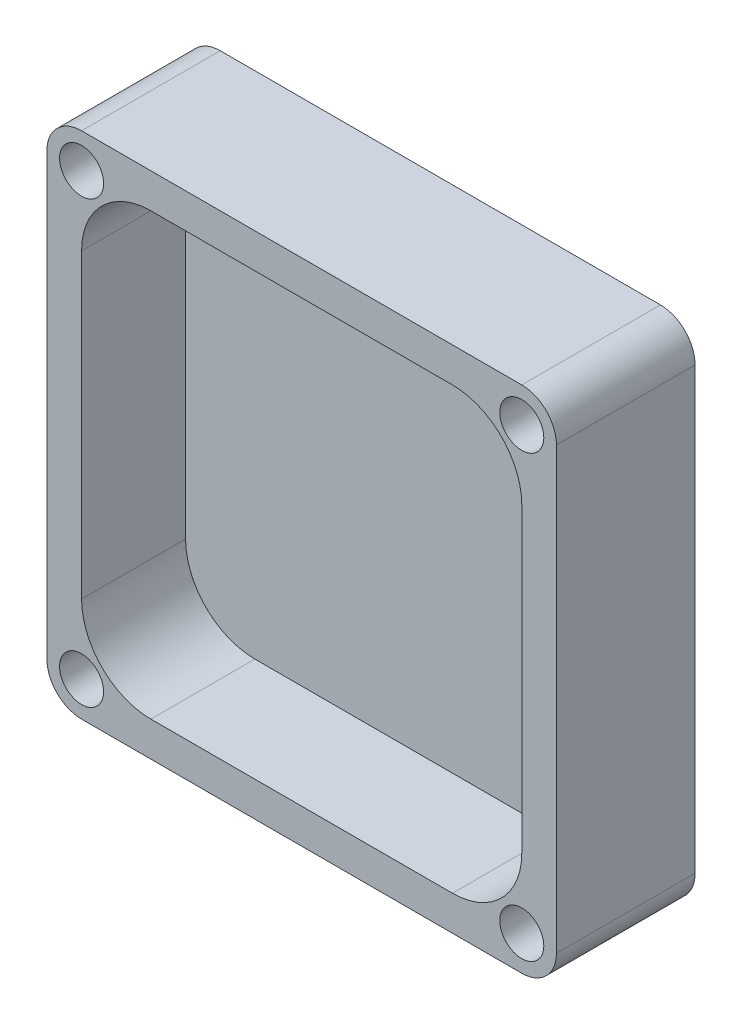
ISO-10303-21;
HEADER;
FILE_DESCRIPTION(('STEP AP214'),'2;1');
FILE_NAME('part.step','',(''),(''),'','','');
FILE_SCHEMA(('AUTOMOTIVE_DESIGN { 1 0 10303 214 1 1 1 1 }'));
ENDSEC;
DATA;
#1=APPLICATION_CONTEXT('core data for automotive mechanical design processes');
#2=APPLICATION_PROTOCOL_DEFINITION('international standard','automotive_design',2000,#1);
#3=PRODUCT_CONTEXT('',#1,'mechanical');
#4=PRODUCT('Part','Part','',(#3));
#5=PRODUCT_RELATED_PRODUCT_CATEGORY('part','',(#4));
#6=PRODUCT_DEFINITION_FORMATION('','',#4);
#7=PRODUCT_DEFINITION_CONTEXT('part definition',#1,'design');
#8=PRODUCT_DEFINITION('design','',#6,#7);
#9=PRODUCT_DEFINITION_SHAPE('','',#8);
#10=(LENGTH_UNIT() NAMED_UNIT(*) SI_UNIT(.MILLI.,.METRE.));
#11=(NAMED_UNIT(*) PLANE_ANGLE_UNIT() SI_UNIT($,.RADIAN.));
#12=(NAMED_UNIT(*) SI_UNIT($,.STERADIAN.) SOLID_ANGLE_UNIT());
#13=UNCERTAINTY_MEASURE_WITH_UNIT(LENGTH_MEASURE(1.E-05),#10,'distance_accuracy_value','');
#14=(GEOMETRIC_REPRESENTATION_CONTEXT(3) GLOBAL_UNCERTAINTY_ASSIGNED_CONTEXT((#13)) GLOBAL_UNIT_ASSIGNED_CONTEXT((#10,
#11,#12)) REPRESENTATION_CONTEXT('',''));
#15=CARTESIAN_POINT('',(0.,0.,0.));
#16=DIRECTION('',(0.,0.,1.));
#17=DIRECTION('',(1.,0.,0.));
#18=AXIS2_PLACEMENT_3D('',#15,#16,#17);
#19=CARTESIAN_POINT('',(0.,0.,0.));
#20=DIRECTION('',(0.,0.,-1.));
#21=DIRECTION('',(-1.,0.,0.));
#22=AXIS2_PLACEMENT_3D('',#19,#20,#21);
#23=PLANE('',#22);
#24=CARTESIAN_POINT('',(63.5,-63.5,0.));
#25=DIRECTION('',(0.,0.,1.));
#26=DIRECTION('',(1.,0.,0.));
#27=AXIS2_PLACEMENT_3D('',#24,#25,#26);
#28=CIRCLE('',#27,6.35);
#29=CARTESIAN_POINT('',(69.85,-63.5,0.));
#30=VERTEX_POINT('',#29);
#31=EDGE_CURVE('E249',#30,#30,#28,.T.);
#32=ORIENTED_EDGE('',*,*,#31,.T.);
#33=EDGE_LOOP('',(#32));
#34=FACE_BOUND('',#33,.T.);
#35=CARTESIAN_POINT('',(-63.5,63.5,0.));
#36=DIRECTION('',(0.,0.,1.));
#37=DIRECTION('',(1.,0.,0.));
#38=AXIS2_PLACEMENT_3D('',#35,#36,#37);
#39=CIRCLE('',#38,6.35000000000002);
#40=CARTESIAN_POINT('',(-57.15,63.5,0.));
#41=VERTEX_POINT('',#40);
#42=EDGE_CURVE('E255',#41,#41,#39,.T.);
#43=ORIENTED_EDGE('',*,*,#42,.T.);
#44=EDGE_LOOP('',(#43));
#45=FACE_BOUND('',#44,.T.);
#46=DIRECTION('',(-1.,0.,0.));
#47=VECTOR('',#46,1.);
#48=CARTESIAN_POINT('',(73.5,73.5,0.));
#49=LINE('',#48,#47);
#50=CARTESIAN_POINT('',(63.5,73.5,0.));
#51=VERTEX_POINT('',#50);
#52=CARTESIAN_POINT('',(-63.5,73.5,0.));
#53=VERTEX_POINT('',#52);
#54=EDGE_CURVE('E263',#51,#53,#49,.T.);
#55=ORIENTED_EDGE('',*,*,#54,.F.);
#56=CARTESIAN_POINT('',(63.5,63.5,0.));
#57=DIRECTION('',(0.,0.,-1.));
#58=DIRECTION('',(-1.,0.,0.));
#59=AXIS2_PLACEMENT_3D('',#56,#57,#58);
#60=CIRCLE('',#59,10.);
#61=CARTESIAN_POINT('',(73.5,63.4999999999999,0.));
#62=VERTEX_POINT('',#61);
#63=EDGE_CURVE('E280',#51,#62,#60,.T.);
#64=ORIENTED_EDGE('',*,*,#63,.T.);
#65=DIRECTION('',(0.,1.,0.));
#66=VECTOR('',#65,1.);
#67=CARTESIAN_POINT('',(73.5,-73.5,0.));
#68=LINE('',#67,#66);
#69=CARTESIAN_POINT('',(73.5,-63.5,0.));
#70=VERTEX_POINT('',#69);
#71=EDGE_CURVE('E260',#70,#62,#68,.T.);
#72=ORIENTED_EDGE('',*,*,#71,.F.);
#73=CARTESIAN_POINT('',(63.5,-63.5,0.));
#74=DIRECTION('',(0.,0.,-1.));
#75=DIRECTION('',(-1.,0.,0.));
#76=AXIS2_PLACEMENT_3D('',#73,#74,#75);
#77=CIRCLE('',#76,10.);
#78=CARTESIAN_POINT('',(63.5,-73.5,0.));
#79=VERTEX_POINT('',#78);
#80=EDGE_CURVE('E278',#70,#79,#77,.T.);
#81=ORIENTED_EDGE('',*,*,#80,.T.);
#82=DIRECTION('',(1.,0.,0.));
#83=VECTOR('',#82,1.);
#84=CARTESIAN_POINT('',(73.5,-73.5,0.));
#85=LINE('',#84,#83);
#86=CARTESIAN_POINT('',(-63.5,-73.5,0.));
#87=VERTEX_POINT('',#86);
#88=EDGE_CURVE('E258',#87,#79,#85,.T.);
#89=ORIENTED_EDGE('',*,*,#88,.F.);
#90=CARTESIAN_POINT('',(-63.5,-63.5,0.));
#91=DIRECTION('',(0.,0.,-1.));
#92=DIRECTION('',(-1.,0.,0.));
#93=AXIS2_PLACEMENT_3D('',#90,#91,#92);
#94=CIRCLE('',#93,10.);
#95=CARTESIAN_POINT('',(-73.5,-63.5,0.));
#96=VERTEX_POINT('',#95);
#97=EDGE_CURVE('E276',#87,#96,#94,.T.);
#98=ORIENTED_EDGE('',*,*,#97,.T.);
#99=DIRECTION('',(0.,-1.,0.));
#100=VECTOR('',#99,1.);
#101=CARTESIAN_POINT('',(-73.5,-73.5,0.));
#102=LINE('',#101,#100);
#103=CARTESIAN_POINT('',(-73.5,63.5,0.));
#104=VERTEX_POINT('',#103);
#105=EDGE_CURVE('E266',#104,#96,#102,.T.);
#106=ORIENTED_EDGE('',*,*,#105,.F.);
#107=CARTESIAN_POINT('',(-63.5,63.5,0.));
#108=DIRECTION('',(0.,0.,-1.));
#109=DIRECTION('',(-1.,0.,0.));
#110=AXIS2_PLACEMENT_3D('',#107,#108,#109);
#111=CIRCLE('',#110,10.);
#112=EDGE_CURVE('E274',#104,#53,#111,.T.);
#113=ORIENTED_EDGE('',*,*,#112,.T.);
#114=EDGE_LOOP('',(#55,#64,#72,#81,#89,#98,#106,#113));
#115=FACE_BOUND('',#114,.T.);
#116=CARTESIAN_POINT('',(63.5,63.5,0.));
#117=DIRECTION('',(0.,0.,1.));
#118=DIRECTION('',(1.,0.,0.));
#119=AXIS2_PLACEMENT_3D('',#116,#117,#118);
#120=CIRCLE('',#119,6.34999999999999);
#121=CARTESIAN_POINT('',(69.85,63.5,0.));
#122=VERTEX_POINT('',#121);
#123=EDGE_CURVE('E252',#122,#122,#120,.T.);
#124=ORIENTED_EDGE('',*,*,#123,.T.);
#125=EDGE_LOOP('',(#124));
#126=FACE_BOUND('',#125,.T.);
#127=CARTESIAN_POINT('',(-63.5,-63.5,0.));
#128=DIRECTION('',(0.,0.,1.));
#129=DIRECTION('',(1.,0.,0.));
#130=AXIS2_PLACEMENT_3D('',#127,#128,#129);
#131=CIRCLE('',#130,6.35);
#132=CARTESIAN_POINT('',(-57.15,-63.5,0.));
#133=VERTEX_POINT('',#132);
#134=EDGE_CURVE('E246',#133,#133,#131,.T.);
#135=ORIENTED_EDGE('',*,*,#134,.T.);
#136=EDGE_LOOP('',(#135));
#137=FACE_BOUND('',#136,.T.);
#138=ADVANCED_FACE('F39',(#34,#45,#115,#126,#137),#23,.T.);
#139=CARTESIAN_POINT('',(73.5,-73.5,10.));
#140=DIRECTION('',(0.,1.,0.));
#141=DIRECTION('',(0.,0.,1.));
#142=AXIS2_PLACEMENT_3D('',#139,#140,#141);
#143=PLANE('',#142);
#144=ORIENTED_EDGE('',*,*,#88,.T.);
#145=DIRECTION('',(0.,0.,-1.));
#146=VECTOR('',#145,1.);
#147=CARTESIAN_POINT('',(63.5,-73.5,10.));
#148=LINE('',#147,#146);
#149=CARTESIAN_POINT('',(63.5,-73.5,40.));
#150=VERTEX_POINT('',#149);
#151=EDGE_CURVE('E54',#79,#150,#148,.F.);
#152=ORIENTED_EDGE('',*,*,#151,.T.);
#153=DIRECTION('',(1.,0.,0.));
#154=VECTOR('',#153,1.);
#155=CARTESIAN_POINT('',(-73.5,-73.5,40.));
#156=LINE('',#155,#154);
#157=CARTESIAN_POINT('',(-63.5,-73.5,40.));
#158=VERTEX_POINT('',#157);
#159=EDGE_CURVE('E238',#158,#150,#156,.T.);
#160=ORIENTED_EDGE('',*,*,#159,.F.);
#161=DIRECTION('',(0.,0.,-1.));
#162=VECTOR('',#161,1.);
#163=CARTESIAN_POINT('',(-63.5,-73.5,10.));
#164=LINE('',#163,#162);
#165=EDGE_CURVE('E294',#158,#87,#164,.T.);
#166=ORIENTED_EDGE('',*,*,#165,.T.);
#167=EDGE_LOOP('',(#144,#152,#160,#166));
#168=FACE_BOUND('',#167,.T.);
#169=ADVANCED_FACE('F313',(#168),#143,.F.);
#170=CARTESIAN_POINT('',(73.5,-73.5,10.));
#171=DIRECTION('',(-1.,0.,0.));
#172=DIRECTION('',(0.,0.,1.));
#173=AXIS2_PLACEMENT_3D('',#170,#171,#172);
#174=PLANE('',#173);
#175=ORIENTED_EDGE('',*,*,#71,.T.);
#176=DIRECTION('',(0.,0.,-1.));
#177=VECTOR('',#176,1.);
#178=CARTESIAN_POINT('',(73.5,63.5,10.));
#179=LINE('',#178,#177);
#180=CARTESIAN_POINT('',(73.5,63.4999999999999,40.));
#181=VERTEX_POINT('',#180);
#182=EDGE_CURVE('E285',#62,#181,#179,.F.);
#183=ORIENTED_EDGE('',*,*,#182,.T.);
#184=DIRECTION('',(0.,1.,0.));
#185=VECTOR('',#184,1.);
#186=CARTESIAN_POINT('',(73.5,-73.5,40.));
#187=LINE('',#186,#185);
#188=CARTESIAN_POINT('',(73.5,-63.5,40.));
#189=VERTEX_POINT('',#188);
#190=EDGE_CURVE('E240',#189,#181,#187,.T.);
#191=ORIENTED_EDGE('',*,*,#190,.F.);
#192=DIRECTION('',(0.,0.,-1.));
#193=VECTOR('',#192,1.);
#194=CARTESIAN_POINT('',(73.5,-63.5,10.));
#195=LINE('',#194,#193);
#196=EDGE_CURVE('E282',#189,#70,#195,.T.);
#197=ORIENTED_EDGE('',*,*,#196,.T.);
#198=EDGE_LOOP('',(#175,#183,#191,#197));
#199=FACE_BOUND('',#198,.T.);
#200=ADVANCED_FACE('F322',(#199),#174,.F.);
#201=CARTESIAN_POINT('',(73.5,73.5,10.));
#202=DIRECTION('',(0.,-1.,0.));
#203=DIRECTION('',(1.,0.,0.));
#204=AXIS2_PLACEMENT_3D('',#201,#202,#203);
#205=PLANE('',#204);
#206=DIRECTION('',(-1.,0.,0.));
#207=VECTOR('',#206,1.);
#208=CARTESIAN_POINT('',(73.5,73.5,40.));
#209=LINE('',#208,#207);
#210=CARTESIAN_POINT('',(63.5,73.5,40.));
#211=VERTEX_POINT('',#210);
#212=CARTESIAN_POINT('',(-63.5,73.5,40.));
#213=VERTEX_POINT('',#212);
#214=EDGE_CURVE('E243',#211,#213,#209,.T.);
#215=ORIENTED_EDGE('',*,*,#214,.F.);
#216=DIRECTION('',(0.,0.,-1.));
#217=VECTOR('',#216,1.);
#218=CARTESIAN_POINT('',(63.5,73.5,10.));
#219=LINE('',#218,#217);
#220=EDGE_CURVE('E271',#211,#51,#219,.T.);
#221=ORIENTED_EDGE('',*,*,#220,.T.);
#222=ORIENTED_EDGE('',*,*,#54,.T.);
#223=DIRECTION('',(0.,0.,-1.));
#224=VECTOR('',#223,1.);
#225=CARTESIAN_POINT('',(-63.5,73.5,10.));
#226=LINE('',#225,#224);
#227=EDGE_CURVE('E269',#53,#213,#226,.F.);
#228=ORIENTED_EDGE('',*,*,#227,.T.);
#229=EDGE_LOOP('',(#215,#221,#222,#228));
#230=FACE_BOUND('',#229,.T.);
#231=ADVANCED_FACE('F330',(#230),#205,.F.);
#232=CARTESIAN_POINT('',(-73.5,-73.5,10.));
#233=DIRECTION('',(1.,0.,0.));
#234=DIRECTION('',(0.,1.,0.));
#235=AXIS2_PLACEMENT_3D('',#232,#233,#234);
#236=PLANE('',#235);
#237=ORIENTED_EDGE('',*,*,#105,.T.);
#238=DIRECTION('',(0.,0.,-1.));
#239=VECTOR('',#238,1.);
#240=CARTESIAN_POINT('',(-73.5,-63.5,10.));
#241=LINE('',#240,#239);
#242=CARTESIAN_POINT('',(-73.5,-63.5,40.));
#243=VERTEX_POINT('',#242);
#244=EDGE_CURVE('E11',#96,#243,#241,.F.);
#245=ORIENTED_EDGE('',*,*,#244,.T.);
#246=DIRECTION('',(0.,-1.,0.));
#247=VECTOR('',#246,1.);
#248=CARTESIAN_POINT('',(-73.5,73.5,40.));
#249=LINE('',#248,#247);
#250=CARTESIAN_POINT('',(-73.5,63.5,40.));
#251=VERTEX_POINT('',#250);
#252=EDGE_CURVE('E236',#251,#243,#249,.T.);
#253=ORIENTED_EDGE('',*,*,#252,.F.);
#254=DIRECTION('',(0.,0.,-1.));
#255=VECTOR('',#254,1.);
#256=CARTESIAN_POINT('',(-73.5,63.5,10.));
#257=LINE('',#256,#255);
#258=EDGE_CURVE('E47',#251,#104,#257,.T.);
#259=ORIENTED_EDGE('',*,*,#258,.T.);
#260=EDGE_LOOP('',(#237,#245,#253,#259));
#261=FACE_BOUND('',#260,.T.);
#262=ADVANCED_FACE('F302',(#261),#236,.F.);
#263=CARTESIAN_POINT('',(-63.5,63.5,10.));
#264=DIRECTION('',(0.,0.,-1.));
#265=DIRECTION('',(-1.,0.,0.));
#266=AXIS2_PLACEMENT_3D('',#263,#264,#265);
#267=CYLINDRICAL_SURFACE('',#266,6.35000000000002);
#268=ORIENTED_EDGE('',*,*,#42,.F.);
#269=EDGE_LOOP('',(#268));
#270=FACE_BOUND('',#269,.T.);
#271=CARTESIAN_POINT('',(-63.5,63.5,40.));
#272=DIRECTION('',(0.,0.,1.));
#273=DIRECTION('',(1.,0.,0.));
#274=AXIS2_PLACEMENT_3D('',#271,#272,#273);
#275=CIRCLE('',#274,6.35000000000002);
#276=CARTESIAN_POINT('',(-57.15,63.5,40.));
#277=VERTEX_POINT('',#276);
#278=EDGE_CURVE('E172',#277,#277,#275,.T.);
#279=ORIENTED_EDGE('',*,*,#278,.T.);
#280=EDGE_LOOP('',(#279));
#281=FACE_BOUND('',#280,.T.);
#282=ADVANCED_FACE('F350',(#270,#281),#267,.F.);
#283=CARTESIAN_POINT('',(63.5,63.5,10.));
#284=DIRECTION('',(0.,0.,-1.));
#285=DIRECTION('',(-1.,0.,0.));
#286=AXIS2_PLACEMENT_3D('',#283,#284,#285);
#287=CYLINDRICAL_SURFACE('',#286,6.34999999999999);
#288=ORIENTED_EDGE('',*,*,#123,.F.);
#289=EDGE_LOOP('',(#288));
#290=FACE_BOUND('',#289,.T.);
#291=CARTESIAN_POINT('',(63.5,63.5,40.));
#292=DIRECTION('',(0.,0.,1.));
#293=DIRECTION('',(1.,0.,0.));
#294=AXIS2_PLACEMENT_3D('',#291,#292,#293);
#295=CIRCLE('',#294,6.34999999999999);
#296=CARTESIAN_POINT('',(69.85,63.5,40.));
#297=VERTEX_POINT('',#296);
#298=EDGE_CURVE('E227',#297,#297,#295,.T.);
#299=ORIENTED_EDGE('',*,*,#298,.T.);
#300=EDGE_LOOP('',(#299));
#301=FACE_BOUND('',#300,.T.);
#302=ADVANCED_FACE('F490',(#290,#301),#287,.F.);
#303=CARTESIAN_POINT('',(63.5,-63.5,10.));
#304=DIRECTION('',(0.,0.,-1.));
#305=DIRECTION('',(-1.,0.,0.));
#306=AXIS2_PLACEMENT_3D('',#303,#304,#305);
#307=CYLINDRICAL_SURFACE('',#306,6.35);
#308=ORIENTED_EDGE('',*,*,#31,.F.);
#309=EDGE_LOOP('',(#308));
#310=FACE_BOUND('',#309,.T.);
#311=CARTESIAN_POINT('',(63.5,-63.5,40.));
#312=DIRECTION('',(0.,0.,1.));
#313=DIRECTION('',(1.,0.,0.));
#314=AXIS2_PLACEMENT_3D('',#311,#312,#313);
#315=CIRCLE('',#314,6.35);
#316=CARTESIAN_POINT('',(69.85,-63.5,40.));
#317=VERTEX_POINT('',#316);
#318=EDGE_CURVE('E230',#317,#317,#315,.T.);
#319=ORIENTED_EDGE('',*,*,#318,.T.);
#320=EDGE_LOOP('',(#319));
#321=FACE_BOUND('',#320,.T.);
#322=ADVANCED_FACE('F480',(#310,#321),#307,.F.);
#323=CARTESIAN_POINT('',(-63.5,-63.5,10.));
#324=DIRECTION('',(0.,0.,-1.));
#325=DIRECTION('',(-1.,0.,0.));
#326=AXIS2_PLACEMENT_3D('',#323,#324,#325);
#327=CYLINDRICAL_SURFACE('',#326,6.35);
#328=ORIENTED_EDGE('',*,*,#134,.F.);
#329=EDGE_LOOP('',(#328));
#330=FACE_BOUND('',#329,.T.);
#331=CARTESIAN_POINT('',(-63.5,-63.5,40.));
#332=DIRECTION('',(0.,0.,1.));
#333=DIRECTION('',(1.,0.,0.));
#334=AXIS2_PLACEMENT_3D('',#331,#332,#333);
#335=CIRCLE('',#334,6.35);
#336=CARTESIAN_POINT('',(-57.15,-63.5,40.));
#337=VERTEX_POINT('',#336);
#338=EDGE_CURVE('E233',#337,#337,#335,.T.);
#339=ORIENTED_EDGE('',*,*,#338,.T.);
#340=EDGE_LOOP('',(#339));
#341=FACE_BOUND('',#340,.T.);
#342=ADVANCED_FACE('F469',(#330,#341),#327,.F.);
#343=CARTESIAN_POINT('',(0.,0.,40.));
#344=DIRECTION('',(0.,0.,1.));
#345=DIRECTION('',(1.,0.,0.));
#346=AXIS2_PLACEMENT_3D('',#343,#344,#345);
#347=PLANE('',#346);
#348=ORIENTED_EDGE('',*,*,#298,.F.);
#349=EDGE_LOOP('',(#348));
#350=FACE_BOUND('',#349,.T.);
#351=ORIENTED_EDGE('',*,*,#338,.F.);
#352=EDGE_LOOP('',(#351));
#353=FACE_BOUND('',#352,.T.);
#354=ORIENTED_EDGE('',*,*,#190,.T.);
#355=CARTESIAN_POINT('',(63.5,63.5,40.));
#356=DIRECTION('',(0.,0.,1.));
#357=DIRECTION('',(1.,0.,0.));
#358=AXIS2_PLACEMENT_3D('',#355,#356,#357);
#359=CIRCLE('',#358,10.);
#360=EDGE_CURVE('E292',#181,#211,#359,.T.);
#361=ORIENTED_EDGE('',*,*,#360,.T.);
#362=ORIENTED_EDGE('',*,*,#214,.T.);
#363=CARTESIAN_POINT('',(-63.5,63.5,40.));
#364=DIRECTION('',(0.,0.,1.));
#365=DIRECTION('',(1.,0.,0.));
#366=AXIS2_PLACEMENT_3D('',#363,#364,#365);
#367=CIRCLE('',#366,10.);
#368=EDGE_CURVE('E287',#213,#251,#367,.T.);
#369=ORIENTED_EDGE('',*,*,#368,.T.);
#370=ORIENTED_EDGE('',*,*,#252,.T.);
#371=CARTESIAN_POINT('',(-63.5,-63.5,40.));
#372=DIRECTION('',(0.,0.,1.));
#373=DIRECTION('',(1.,0.,0.));
#374=AXIS2_PLACEMENT_3D('',#371,#372,#373);
#375=CIRCLE('',#374,10.);
#376=EDGE_CURVE('E61',#243,#158,#375,.T.);
#377=ORIENTED_EDGE('',*,*,#376,.T.);
#378=ORIENTED_EDGE('',*,*,#159,.T.);
#379=CARTESIAN_POINT('',(63.5,-63.5,40.));
#380=DIRECTION('',(0.,0.,1.));
#381=DIRECTION('',(1.,0.,0.));
#382=AXIS2_PLACEMENT_3D('',#379,#380,#381);
#383=CIRCLE('',#382,10.);
#384=EDGE_CURVE('E290',#150,#189,#383,.T.);
#385=ORIENTED_EDGE('',*,*,#384,.T.);
#386=EDGE_LOOP('',(#354,#361,#362,#369,#370,#377,#378,#385));
#387=FACE_BOUND('',#386,.T.);
#388=ORIENTED_EDGE('',*,*,#318,.F.);
#389=EDGE_LOOP('',(#388));
#390=FACE_BOUND('',#389,.T.);
#391=ORIENTED_EDGE('',*,*,#278,.F.);
#392=EDGE_LOOP('',(#391));
#393=FACE_BOUND('',#392,.T.);
#394=DIRECTION('',(1.,0.,0.));
#395=VECTOR('',#394,1.);
#396=CARTESIAN_POINT('',(-43.4999999999999,-63.5,40.));
#397=LINE('',#396,#395);
#398=CARTESIAN_POINT('',(-43.4999999999999,-63.5,40.));
#399=VERTEX_POINT('',#398);
#400=CARTESIAN_POINT('',(43.4999999999999,-63.5,40.));
#401=VERTEX_POINT('',#400);
#402=EDGE_CURVE('E164',#399,#401,#397,.T.);
#403=ORIENTED_EDGE('',*,*,#402,.F.);
#404=CARTESIAN_POINT('',(-43.5,-43.5,40.));
#405=DIRECTION('',(0.,0.,1.));
#406=DIRECTION('',(1.,0.,0.));
#407=AXIS2_PLACEMENT_3D('',#404,#405,#406);
#408=CIRCLE('',#407,20.);
#409=CARTESIAN_POINT('',(-63.5,-43.4999999999999,40.));
#410=VERTEX_POINT('',#409);
#411=EDGE_CURVE('E154',#410,#399,#408,.T.);
#412=ORIENTED_EDGE('',*,*,#411,.F.);
#413=DIRECTION('',(0.,-1.,0.));
#414=VECTOR('',#413,1.);
#415=CARTESIAN_POINT('',(-63.5,43.4999999999998,40.));
#416=LINE('',#415,#414);
#417=CARTESIAN_POINT('',(-63.5,43.4999999999998,40.));
#418=VERTEX_POINT('',#417);
#419=EDGE_CURVE('E191',#418,#410,#416,.T.);
#420=ORIENTED_EDGE('',*,*,#419,.F.);
#421=CARTESIAN_POINT('',(-43.5,43.5,40.));
#422=DIRECTION('',(0.,0.,1.));
#423=DIRECTION('',(-1.,0.,0.));
#424=AXIS2_PLACEMENT_3D('',#421,#422,#423);
#425=CIRCLE('',#424,20.);
#426=CARTESIAN_POINT('',(-43.4999999999999,63.5,40.));
#427=VERTEX_POINT('',#426);
#428=EDGE_CURVE('E188',#427,#418,#425,.T.);
#429=ORIENTED_EDGE('',*,*,#428,.F.);
#430=DIRECTION('',(-1.,0.,0.));
#431=VECTOR('',#430,1.);
#432=CARTESIAN_POINT('',(43.4999999999999,63.5,40.));
#433=LINE('',#432,#431);
#434=CARTESIAN_POINT('',(43.4999999999999,63.5,40.));
#435=VERTEX_POINT('',#434);
#436=EDGE_CURVE('E186',#435,#427,#433,.T.);
#437=ORIENTED_EDGE('',*,*,#436,.F.);
#438=CARTESIAN_POINT('',(43.5,43.5,40.));
#439=DIRECTION('',(0.,0.,1.));
#440=DIRECTION('',(1.,0.,0.));
#441=AXIS2_PLACEMENT_3D('',#438,#439,#440);
#442=CIRCLE('',#441,20.);
#443=CARTESIAN_POINT('',(63.5,43.4999999999999,40.));
#444=VERTEX_POINT('',#443);
#445=EDGE_CURVE('E184',#444,#435,#442,.T.);
#446=ORIENTED_EDGE('',*,*,#445,.F.);
#447=DIRECTION('',(0.,1.,0.));
#448=VECTOR('',#447,1.);
#449=CARTESIAN_POINT('',(63.5,-43.4999999999999,40.));
#450=LINE('',#449,#448);
#451=CARTESIAN_POINT('',(63.5,-43.4999999999999,40.));
#452=VERTEX_POINT('',#451);
#453=EDGE_CURVE('E180',#452,#444,#450,.T.);
#454=ORIENTED_EDGE('',*,*,#453,.F.);
#455=CARTESIAN_POINT('',(43.5,-43.5,40.));
#456=DIRECTION('',(0.,0.,1.));
#457=DIRECTION('',(1.,0.,0.));
#458=AXIS2_PLACEMENT_3D('',#455,#456,#457);
#459=CIRCLE('',#458,20.);
#460=EDGE_CURVE('E178',#401,#452,#459,.T.);
#461=ORIENTED_EDGE('',*,*,#460,.F.);
#462=EDGE_LOOP('',(#403,#412,#420,#429,#437,#446,#454,#461));
#463=FACE_BOUND('',#462,.T.);
#464=ADVANCED_FACE('F176',(#350,#353,#387,#390,#393,#463),#347,.T.);
#465=CARTESIAN_POINT('',(-43.5,-43.5,40.));
#466=DIRECTION('',(0.,0.,-1.));
#467=DIRECTION('',(-1.,0.,0.));
#468=AXIS2_PLACEMENT_3D('',#465,#466,#467);
#469=CYLINDRICAL_SURFACE('',#468,20.);
#470=CARTESIAN_POINT('',(-43.5,-43.5,10.));
#471=DIRECTION('',(0.,0.,1.));
#472=DIRECTION('',(1.,0.,0.));
#473=AXIS2_PLACEMENT_3D('',#470,#471,#472);
#474=CIRCLE('',#473,20.);
#475=CARTESIAN_POINT('',(-63.5,-43.4999999999999,10.));
#476=VERTEX_POINT('',#475);
#477=CARTESIAN_POINT('',(-43.4999999999999,-63.5,10.));
#478=VERTEX_POINT('',#477);
#479=EDGE_CURVE('E193',#476,#478,#474,.T.);
#480=ORIENTED_EDGE('',*,*,#479,.F.);
#481=DIRECTION('',(0.,0.,-1.));
#482=VECTOR('',#481,1.);
#483=CARTESIAN_POINT('',(-63.5,-43.4999999999999,40.));
#484=LINE('',#483,#482);
#485=EDGE_CURVE('E160',#410,#476,#484,.T.);
#486=ORIENTED_EDGE('',*,*,#485,.F.);
#487=ORIENTED_EDGE('',*,*,#411,.T.);
#488=DIRECTION('',(0.,0.,-1.));
#489=VECTOR('',#488,1.);
#490=CARTESIAN_POINT('',(-43.4999999999999,-63.5,40.));
#491=LINE('',#490,#489);
#492=EDGE_CURVE('E158',#399,#478,#491,.T.);
#493=ORIENTED_EDGE('',*,*,#492,.T.);
#494=EDGE_LOOP('',(#480,#486,#487,#493));
#495=FACE_BOUND('',#494,.T.);
#496=ADVANCED_FACE('F157',(#495),#469,.F.);
#497=CARTESIAN_POINT('',(-43.4999999999999,-63.5,40.));
#498=DIRECTION('',(0.,1.,0.));
#499=DIRECTION('',(-1.,0.,0.));
#500=AXIS2_PLACEMENT_3D('',#497,#498,#499);
#501=PLANE('',#500);
#502=DIRECTION('',(1.,0.,0.));
#503=VECTOR('',#502,1.);
#504=CARTESIAN_POINT('',(-43.4999999999999,-63.5,10.));
#505=LINE('',#504,#503);
#506=CARTESIAN_POINT('',(43.4999999999999,-63.5,10.));
#507=VERTEX_POINT('',#506);
#508=EDGE_CURVE('E171',#478,#507,#505,.T.);
#509=ORIENTED_EDGE('',*,*,#508,.F.);
#510=ORIENTED_EDGE('',*,*,#492,.F.);
#511=ORIENTED_EDGE('',*,*,#402,.T.);
#512=DIRECTION('',(0.,0.,-1.));
#513=VECTOR('',#512,1.);
#514=CARTESIAN_POINT('',(43.4999999999999,-63.5,40.));
#515=LINE('',#514,#513);
#516=EDGE_CURVE('E173',#401,#507,#515,.T.);
#517=ORIENTED_EDGE('',*,*,#516,.T.);
#518=EDGE_LOOP('',(#509,#510,#511,#517));
#519=FACE_BOUND('',#518,.T.);
#520=ADVANCED_FACE('F168',(#519),#501,.T.);
#521=CARTESIAN_POINT('',(43.5,-43.5,40.));
#522=DIRECTION('',(0.,0.,-1.));
#523=DIRECTION('',(-1.,0.,0.));
#524=AXIS2_PLACEMENT_3D('',#521,#522,#523);
#525=CYLINDRICAL_SURFACE('',#524,20.);
#526=CARTESIAN_POINT('',(43.5,-43.5,10.));
#527=DIRECTION('',(0.,0.,1.));
#528=DIRECTION('',(1.,0.,0.));
#529=AXIS2_PLACEMENT_3D('',#526,#527,#528);
#530=CIRCLE('',#529,20.);
#531=CARTESIAN_POINT('',(63.5,-43.4999999999999,10.));
#532=VERTEX_POINT('',#531);
#533=EDGE_CURVE('E196',#507,#532,#530,.T.);
#534=ORIENTED_EDGE('',*,*,#533,.F.);
#535=ORIENTED_EDGE('',*,*,#516,.F.);
#536=ORIENTED_EDGE('',*,*,#460,.T.);
#537=DIRECTION('',(0.,0.,-1.));
#538=VECTOR('',#537,1.);
#539=CARTESIAN_POINT('',(63.5,-43.4999999999999,40.));
#540=LINE('',#539,#538);
#541=EDGE_CURVE('E222',#452,#532,#540,.T.);
#542=ORIENTED_EDGE('',*,*,#541,.T.);
#543=EDGE_LOOP('',(#534,#535,#536,#542));
#544=FACE_BOUND('',#543,.T.);
#545=ADVANCED_FACE('F434',(#544),#525,.F.);
#546=CARTESIAN_POINT('',(63.5,-43.4999999999999,40.));
#547=DIRECTION('',(-1.,0.,0.));
#548=DIRECTION('',(0.,0.,1.));
#549=AXIS2_PLACEMENT_3D('',#546,#547,#548);
#550=PLANE('',#549);
#551=DIRECTION('',(0.,1.,0.));
#552=VECTOR('',#551,1.);
#553=CARTESIAN_POINT('',(63.5,-43.4999999999999,10.));
#554=LINE('',#553,#552);
#555=CARTESIAN_POINT('',(63.5,43.4999999999999,10.));
#556=VERTEX_POINT('',#555);
#557=EDGE_CURVE('E199',#532,#556,#554,.T.);
#558=ORIENTED_EDGE('',*,*,#557,.F.);
#559=ORIENTED_EDGE('',*,*,#541,.F.);
#560=ORIENTED_EDGE('',*,*,#453,.T.);
#561=DIRECTION('',(0.,0.,-1.));
#562=VECTOR('',#561,1.);
#563=CARTESIAN_POINT('',(63.5,43.4999999999999,40.));
#564=LINE('',#563,#562);
#565=EDGE_CURVE('E220',#444,#556,#564,.T.);
#566=ORIENTED_EDGE('',*,*,#565,.T.);
#567=EDGE_LOOP('',(#558,#559,#560,#566));
#568=FACE_BOUND('',#567,.T.);
#569=ADVANCED_FACE('F424',(#568),#550,.T.);
#570=CARTESIAN_POINT('',(43.5,43.5,40.));
#571=DIRECTION('',(0.,0.,-1.));
#572=DIRECTION('',(-1.,0.,0.));
#573=AXIS2_PLACEMENT_3D('',#570,#571,#572);
#574=CYLINDRICAL_SURFACE('',#573,20.);
#575=CARTESIAN_POINT('',(43.5,43.5,10.));
#576=DIRECTION('',(0.,0.,1.));
#577=DIRECTION('',(1.,0.,0.));
#578=AXIS2_PLACEMENT_3D('',#575,#576,#577);
#579=CIRCLE('',#578,20.);
#580=CARTESIAN_POINT('',(43.4999999999999,63.5,10.));
#581=VERTEX_POINT('',#580);
#582=EDGE_CURVE('E202',#556,#581,#579,.T.);
#583=ORIENTED_EDGE('',*,*,#582,.F.);
#584=ORIENTED_EDGE('',*,*,#565,.F.);
#585=ORIENTED_EDGE('',*,*,#445,.T.);
#586=DIRECTION('',(0.,0.,-1.));
#587=VECTOR('',#586,1.);
#588=CARTESIAN_POINT('',(43.4999999999999,63.5,40.));
#589=LINE('',#588,#587);
#590=EDGE_CURVE('E218',#435,#581,#589,.T.);
#591=ORIENTED_EDGE('',*,*,#590,.T.);
#592=EDGE_LOOP('',(#583,#584,#585,#591));
#593=FACE_BOUND('',#592,.T.);
#594=ADVANCED_FACE('F414',(#593),#574,.F.);
#595=CARTESIAN_POINT('',(43.4999999999999,63.5,40.));
#596=DIRECTION('',(0.,-1.,0.));
#597=DIRECTION('',(1.,0.,0.));
#598=AXIS2_PLACEMENT_3D('',#595,#596,#597);
#599=PLANE('',#598);
#600=DIRECTION('',(-1.,0.,0.));
#601=VECTOR('',#600,1.);
#602=CARTESIAN_POINT('',(43.4999999999999,63.5,10.));
#603=LINE('',#602,#601);
#604=CARTESIAN_POINT('',(-43.4999999999999,63.5,10.));
#605=VERTEX_POINT('',#604);
#606=EDGE_CURVE('E205',#581,#605,#603,.T.);
#607=ORIENTED_EDGE('',*,*,#606,.F.);
#608=ORIENTED_EDGE('',*,*,#590,.F.);
#609=ORIENTED_EDGE('',*,*,#436,.T.);
#610=DIRECTION('',(0.,0.,-1.));
#611=VECTOR('',#610,1.);
#612=CARTESIAN_POINT('',(-43.4999999999999,63.5,40.));
#613=LINE('',#612,#611);
#614=EDGE_CURVE('E216',#427,#605,#613,.T.);
#615=ORIENTED_EDGE('',*,*,#614,.T.);
#616=EDGE_LOOP('',(#607,#608,#609,#615));
#617=FACE_BOUND('',#616,.T.);
#618=ADVANCED_FACE('F404',(#617),#599,.T.);
#619=CARTESIAN_POINT('',(-43.5,43.5,40.));
#620=DIRECTION('',(0.,0.,-1.));
#621=DIRECTION('',(-1.,0.,0.));
#622=AXIS2_PLACEMENT_3D('',#619,#620,#621);
#623=CYLINDRICAL_SURFACE('',#622,20.);
#624=CARTESIAN_POINT('',(-43.5,43.5,10.));
#625=DIRECTION('',(0.,0.,1.));
#626=DIRECTION('',(-1.,0.,0.));
#627=AXIS2_PLACEMENT_3D('',#624,#625,#626);
#628=CIRCLE('',#627,20.);
#629=CARTESIAN_POINT('',(-63.5,43.4999999999998,10.));
#630=VERTEX_POINT('',#629);
#631=EDGE_CURVE('E208',#605,#630,#628,.T.);
#632=ORIENTED_EDGE('',*,*,#631,.F.);
#633=ORIENTED_EDGE('',*,*,#614,.F.);
#634=ORIENTED_EDGE('',*,*,#428,.T.);
#635=DIRECTION('',(0.,0.,-1.));
#636=VECTOR('',#635,1.);
#637=CARTESIAN_POINT('',(-63.5,43.4999999999998,40.));
#638=LINE('',#637,#636);
#639=EDGE_CURVE('E214',#418,#630,#638,.T.);
#640=ORIENTED_EDGE('',*,*,#639,.T.);
#641=EDGE_LOOP('',(#632,#633,#634,#640));
#642=FACE_BOUND('',#641,.T.);
#643=ADVANCED_FACE('F394',(#642),#623,.F.);
#644=CARTESIAN_POINT('',(-63.5,43.4999999999998,40.));
#645=DIRECTION('',(1.,0.,0.));
#646=DIRECTION('',(0.,1.,0.));
#647=AXIS2_PLACEMENT_3D('',#644,#645,#646);
#648=PLANE('',#647);
#649=DIRECTION('',(0.,-1.,0.));
#650=VECTOR('',#649,1.);
#651=CARTESIAN_POINT('',(-63.5,43.4999999999998,10.));
#652=LINE('',#651,#650);
#653=EDGE_CURVE('E165',#630,#476,#652,.T.);
#654=ORIENTED_EDGE('',*,*,#653,.F.);
#655=ORIENTED_EDGE('',*,*,#639,.F.);
#656=ORIENTED_EDGE('',*,*,#419,.T.);
#657=ORIENTED_EDGE('',*,*,#485,.T.);
#658=EDGE_LOOP('',(#654,#655,#656,#657));
#659=FACE_BOUND('',#658,.T.);
#660=ADVANCED_FACE('F390',(#659),#648,.T.);
#661=CARTESIAN_POINT('',(0.,0.,10.));
#662=DIRECTION('',(0.,0.,-1.));
#663=DIRECTION('',(-1.,0.,0.));
#664=AXIS2_PLACEMENT_3D('',#661,#662,#663);
#665=PLANE('',#664);
#666=ORIENTED_EDGE('',*,*,#653,.T.);
#667=ORIENTED_EDGE('',*,*,#479,.T.);
#668=ORIENTED_EDGE('',*,*,#508,.T.);
#669=ORIENTED_EDGE('',*,*,#533,.T.);
#670=ORIENTED_EDGE('',*,*,#557,.T.);
#671=ORIENTED_EDGE('',*,*,#582,.T.);
#672=ORIENTED_EDGE('',*,*,#606,.T.);
#673=ORIENTED_EDGE('',*,*,#631,.T.);
#674=EDGE_LOOP('',(#666,#667,#668,#669,#670,#671,#672,#673));
#675=FACE_BOUND('',#674,.T.);
#676=ADVANCED_FACE('F346',(#675),#665,.F.);
#677=CARTESIAN_POINT('',(63.5,63.5,10.));
#678=DIRECTION('',(0.,0.,-1.));
#679=DIRECTION('',(-1.,0.,0.));
#680=AXIS2_PLACEMENT_3D('',#677,#678,#679);
#681=CYLINDRICAL_SURFACE('',#680,10.);
#682=ORIENTED_EDGE('',*,*,#360,.F.);
#683=ORIENTED_EDGE('',*,*,#182,.F.);
#684=ORIENTED_EDGE('',*,*,#63,.F.);
#685=ORIENTED_EDGE('',*,*,#220,.F.);
#686=EDGE_LOOP('',(#682,#683,#684,#685));
#687=FACE_BOUND('',#686,.T.);
#688=ADVANCED_FACE('F327',(#687),#681,.T.);
#689=CARTESIAN_POINT('',(63.5,-63.5,10.));
#690=DIRECTION('',(0.,0.,-1.));
#691=DIRECTION('',(-1.,0.,0.));
#692=AXIS2_PLACEMENT_3D('',#689,#690,#691);
#693=CYLINDRICAL_SURFACE('',#692,10.);
#694=ORIENTED_EDGE('',*,*,#384,.F.);
#695=ORIENTED_EDGE('',*,*,#151,.F.);
#696=ORIENTED_EDGE('',*,*,#80,.F.);
#697=ORIENTED_EDGE('',*,*,#196,.F.);
#698=EDGE_LOOP('',(#694,#695,#696,#697));
#699=FACE_BOUND('',#698,.T.);
#700=ADVANCED_FACE('F319',(#699),#693,.T.);
#701=CARTESIAN_POINT('',(-63.5,-63.5,10.));
#702=DIRECTION('',(0.,0.,-1.));
#703=DIRECTION('',(-1.,0.,0.));
#704=AXIS2_PLACEMENT_3D('',#701,#702,#703);
#705=CYLINDRICAL_SURFACE('',#704,10.);
#706=ORIENTED_EDGE('',*,*,#376,.F.);
#707=ORIENTED_EDGE('',*,*,#244,.F.);
#708=ORIENTED_EDGE('',*,*,#97,.F.);
#709=ORIENTED_EDGE('',*,*,#165,.F.);
#710=EDGE_LOOP('',(#706,#707,#708,#709));
#711=FACE_BOUND('',#710,.T.);
#712=ADVANCED_FACE('F312',(#711),#705,.T.);
#713=CARTESIAN_POINT('',(-63.5,63.5,10.));
#714=DIRECTION('',(0.,0.,-1.));
#715=DIRECTION('',(-1.,0.,0.));
#716=AXIS2_PLACEMENT_3D('',#713,#714,#715);
#717=CYLINDRICAL_SURFACE('',#716,10.);
#718=ORIENTED_EDGE('',*,*,#368,.F.);
#719=ORIENTED_EDGE('',*,*,#227,.F.);
#720=ORIENTED_EDGE('',*,*,#112,.F.);
#721=ORIENTED_EDGE('',*,*,#258,.F.);
#722=EDGE_LOOP('',(#718,#719,#720,#721));
#723=FACE_BOUND('',#722,.T.);
#724=ADVANCED_FACE('F41',(#723),#717,.T.);
#725=CLOSED_SHELL('',(#138,#169,#200,#231,#262,#282,#302,#322,#342,#464,#496,#520,#545,#569,
#594,#618,#643,#660,#676,#688,#700,#712,#724));
#726=MANIFOLD_SOLID_BREP('B2',#725);
#727=ADVANCED_BREP_SHAPE_REPRESENTATION('',(#18,#726),#14);
#728=SHAPE_DEFINITION_REPRESENTATION(#9,#727);
ENDSEC;
END-ISO-10303-21;
